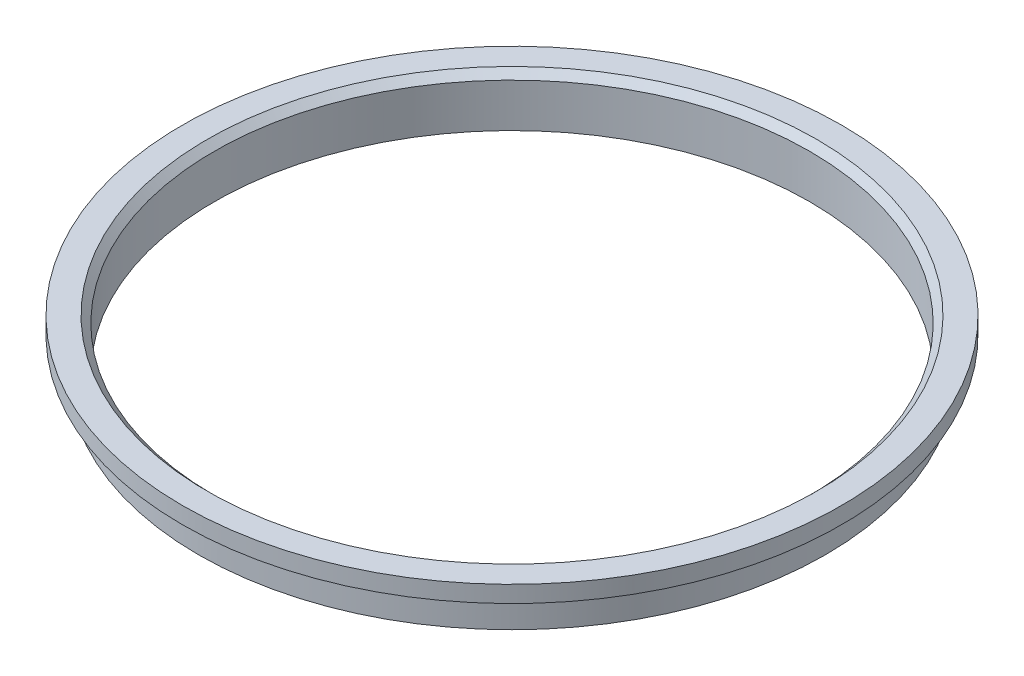
ISO-10303-21;
HEADER;
FILE_DESCRIPTION(('STEP AP214'),'2;1');
FILE_NAME('part.step','',(''),(''),'','','');
FILE_SCHEMA(('AUTOMOTIVE_DESIGN { 1 0 10303 214 1 1 1 1 }'));
ENDSEC;
DATA;
#1=APPLICATION_CONTEXT('core data for automotive mechanical design processes');
#2=APPLICATION_PROTOCOL_DEFINITION('international standard','automotive_design',2000,#1);
#3=PRODUCT_CONTEXT('',#1,'mechanical');
#4=PRODUCT('Part','Part','',(#3));
#5=PRODUCT_RELATED_PRODUCT_CATEGORY('part','',(#4));
#6=PRODUCT_DEFINITION_FORMATION('','',#4);
#7=PRODUCT_DEFINITION_CONTEXT('part definition',#1,'design');
#8=PRODUCT_DEFINITION('design','',#6,#7);
#9=PRODUCT_DEFINITION_SHAPE('','',#8);
#10=(LENGTH_UNIT() NAMED_UNIT(*) SI_UNIT(.MILLI.,.METRE.));
#11=(NAMED_UNIT(*) PLANE_ANGLE_UNIT() SI_UNIT($,.RADIAN.));
#12=(NAMED_UNIT(*) SI_UNIT($,.STERADIAN.) SOLID_ANGLE_UNIT());
#13=UNCERTAINTY_MEASURE_WITH_UNIT(LENGTH_MEASURE(1.E-05),#10,'distance_accuracy_value','');
#14=(GEOMETRIC_REPRESENTATION_CONTEXT(3) GLOBAL_UNCERTAINTY_ASSIGNED_CONTEXT((#13)) GLOBAL_UNIT_ASSIGNED_CONTEXT((#10,
#11,#12)) REPRESENTATION_CONTEXT('',''));
#15=CARTESIAN_POINT('',(0.,0.,0.));
#16=DIRECTION('',(0.,0.,1.));
#17=DIRECTION('',(1.,0.,0.));
#18=AXIS2_PLACEMENT_3D('',#15,#16,#17);
#19=CARTESIAN_POINT('',(-54.55285,-9.27100000000001,0.));
#20=DIRECTION('',(0.,1.,0.));
#21=DIRECTION('',(0.,0.,1.));
#22=AXIS2_PLACEMENT_3D('',#19,#20,#21);
#23=PLANE('',#22);
#24=CARTESIAN_POINT('',(0.,-9.27100000000001,0.));
#25=DIRECTION('',(0.,-1.,0.));
#26=DIRECTION('',(0.,0.,-1.));
#27=AXIS2_PLACEMENT_3D('',#24,#25,#26);
#28=CIRCLE('',#27,54.55285);
#29=CARTESIAN_POINT('',(0.,-9.27100000000001,-54.55285));
#30=VERTEX_POINT('',#29);
#31=EDGE_CURVE('E61',#30,#30,#28,.T.);
#32=ORIENTED_EDGE('',*,*,#31,.F.);
#33=EDGE_LOOP('',(#32));
#34=FACE_BOUND('',#33,.T.);
#35=CARTESIAN_POINT('',(0.,-9.27100000000001,0.));
#36=DIRECTION('',(0.,-1.,0.));
#37=DIRECTION('',(0.,0.,-1.));
#38=AXIS2_PLACEMENT_3D('',#35,#36,#37);
#39=CIRCLE('',#38,57.43575);
#40=CARTESIAN_POINT('',(0.,-9.27100000000001,-57.43575));
#41=VERTEX_POINT('',#40);
#42=EDGE_CURVE('E52',#41,#41,#39,.T.);
#43=ORIENTED_EDGE('',*,*,#42,.T.);
#44=EDGE_LOOP('',(#43));
#45=FACE_BOUND('',#44,.T.);
#46=ADVANCED_FACE('F32',(#34,#45),#23,.F.);
#47=CARTESIAN_POINT('',(0.,0.,0.));
#48=DIRECTION('',(0.,-1.,0.));
#49=DIRECTION('',(0.,0.,-1.));
#50=AXIS2_PLACEMENT_3D('',#47,#48,#49);
#51=CYLINDRICAL_SURFACE('',#50,57.43575);
#52=CARTESIAN_POINT('',(0.,-4.63550000000001,0.));
#53=DIRECTION('',(0.,1.,0.));
#54=DIRECTION('',(0.,0.,1.));
#55=AXIS2_PLACEMENT_3D('',#52,#53,#54);
#56=CIRCLE('',#55,57.43575);
#57=CARTESIAN_POINT('',(0.,-4.63550000000001,57.43575));
#58=VERTEX_POINT('',#57);
#59=EDGE_CURVE('E39',#58,#58,#56,.F.);
#60=ORIENTED_EDGE('',*,*,#59,.T.);
#61=EDGE_LOOP('',(#60));
#62=FACE_BOUND('',#61,.T.);
#63=ORIENTED_EDGE('',*,*,#42,.F.);
#64=EDGE_LOOP('',(#63));
#65=FACE_BOUND('',#64,.T.);
#66=ADVANCED_FACE('F69',(#62,#65),#51,.T.);
#67=CARTESIAN_POINT('',(-57.43575,-3.04800000000001,0.));
#68=DIRECTION('',(0.,1.,0.));
#69=DIRECTION('',(0.,0.,1.));
#70=AXIS2_PLACEMENT_3D('',#67,#68,#69);
#71=PLANE('',#70);
#72=CARTESIAN_POINT('',(0.,-3.04800000000001,0.));
#73=DIRECTION('',(0.,1.,0.));
#74=DIRECTION('',(0.,0.,1.));
#75=AXIS2_PLACEMENT_3D('',#72,#73,#74);
#76=CIRCLE('',#75,59.02325);
#77=CARTESIAN_POINT('',(0.,-3.04800000000001,59.02325));
#78=VERTEX_POINT('',#77);
#79=EDGE_CURVE('E10',#78,#78,#76,.T.);
#80=ORIENTED_EDGE('',*,*,#79,.T.);
#81=EDGE_LOOP('',(#80));
#82=FACE_BOUND('',#81,.T.);
#83=CARTESIAN_POINT('',(0.,-3.04800000000001,0.));
#84=DIRECTION('',(0.,-1.,0.));
#85=DIRECTION('',(0.,0.,-1.));
#86=AXIS2_PLACEMENT_3D('',#83,#84,#85);
#87=CIRCLE('',#86,60.3631);
#88=CARTESIAN_POINT('',(0.,-3.04800000000001,-60.3631));
#89=VERTEX_POINT('',#88);
#90=EDGE_CURVE('E55',#89,#89,#87,.T.);
#91=ORIENTED_EDGE('',*,*,#90,.T.);
#92=EDGE_LOOP('',(#91));
#93=FACE_BOUND('',#92,.T.);
#94=ADVANCED_FACE('F74',(#82,#93),#71,.F.);
#95=CARTESIAN_POINT('',(0.,0.,0.));
#96=DIRECTION('',(0.,-1.,0.));
#97=DIRECTION('',(0.,0.,-1.));
#98=AXIS2_PLACEMENT_3D('',#95,#96,#97);
#99=CYLINDRICAL_SURFACE('',#98,60.3631);
#100=ORIENTED_EDGE('',*,*,#90,.F.);
#101=EDGE_LOOP('',(#100));
#102=FACE_BOUND('',#101,.T.);
#103=CARTESIAN_POINT('',(0.,0.,0.));
#104=DIRECTION('',(0.,-1.,0.));
#105=DIRECTION('',(0.,0.,-1.));
#106=AXIS2_PLACEMENT_3D('',#103,#104,#105);
#107=CIRCLE('',#106,60.3631);
#108=CARTESIAN_POINT('',(0.,0.,-60.3631));
#109=VERTEX_POINT('',#108);
#110=EDGE_CURVE('E58',#109,#109,#107,.T.);
#111=ORIENTED_EDGE('',*,*,#110,.T.);
#112=EDGE_LOOP('',(#111));
#113=FACE_BOUND('',#112,.T.);
#114=ADVANCED_FACE('F79',(#102,#113),#99,.T.);
#115=CARTESIAN_POINT('',(-60.3631,0.,0.));
#116=DIRECTION('',(0.,-1.,0.));
#117=DIRECTION('',(0.,0.,-1.));
#118=AXIS2_PLACEMENT_3D('',#115,#116,#117);
#119=PLANE('',#118);
#120=CARTESIAN_POINT('',(0.,0.,0.));
#121=DIRECTION('',(0.,-1.,0.));
#122=DIRECTION('',(0.,0.,-1.));
#123=AXIS2_PLACEMENT_3D('',#120,#121,#122);
#124=CIRCLE('',#123,55.8228499999999);
#125=CARTESIAN_POINT('',(0.,0.,-55.8228499999999));
#126=VERTEX_POINT('',#125);
#127=EDGE_CURVE('E47',#126,#126,#124,.T.);
#128=ORIENTED_EDGE('',*,*,#127,.T.);
#129=EDGE_LOOP('',(#128));
#130=FACE_BOUND('',#129,.T.);
#131=ORIENTED_EDGE('',*,*,#110,.F.);
#132=EDGE_LOOP('',(#131));
#133=FACE_BOUND('',#132,.T.);
#134=ADVANCED_FACE('F90',(#130,#133),#119,.F.);
#135=CARTESIAN_POINT('',(0.,0.,0.));
#136=DIRECTION('',(0.,-1.,0.));
#137=DIRECTION('',(0.,0.,-1.));
#138=AXIS2_PLACEMENT_3D('',#135,#136,#137);
#139=CYLINDRICAL_SURFACE('',#138,54.55285);
#140=CARTESIAN_POINT('',(0.,-1.26999999999998,0.));
#141=DIRECTION('',(0.,-1.,0.));
#142=DIRECTION('',(0.,0.,-1.));
#143=AXIS2_PLACEMENT_3D('',#140,#141,#142);
#144=CIRCLE('',#143,54.55285);
#145=CARTESIAN_POINT('',(0.,-1.26999999999998,-54.55285));
#146=VERTEX_POINT('',#145);
#147=EDGE_CURVE('E43',#146,#146,#144,.F.);
#148=ORIENTED_EDGE('',*,*,#147,.T.);
#149=EDGE_LOOP('',(#148));
#150=FACE_BOUND('',#149,.T.);
#151=ORIENTED_EDGE('',*,*,#31,.T.);
#152=EDGE_LOOP('',(#151));
#153=FACE_BOUND('',#152,.T.);
#154=ADVANCED_FACE('F65',(#150,#153),#139,.F.);
#155=CARTESIAN_POINT('',(0.,0.,0.));
#156=DIRECTION('',(0.,1.,0.));
#157=DIRECTION('',(0.,0.,1.));
#158=AXIS2_PLACEMENT_3D('',#155,#156,#157);
#159=CONICAL_SURFACE('',#158,55.8228499999999,0.785398163397443);
#160=ORIENTED_EDGE('',*,*,#147,.F.);
#161=EDGE_LOOP('',(#160));
#162=FACE_BOUND('',#161,.T.);
#163=ORIENTED_EDGE('',*,*,#127,.F.);
#164=EDGE_LOOP('',(#163));
#165=FACE_BOUND('',#164,.T.);
#166=ADVANCED_FACE('F82',(#162,#165),#159,.F.);
#167=CARTESIAN_POINT('',(0.,-4.63550000000001,0.));
#168=DIRECTION('',(0.,1.,0.));
#169=DIRECTION('',(0.,0.,1.));
#170=AXIS2_PLACEMENT_3D('',#167,#168,#169);
#171=TOROIDAL_SURFACE('',#170,59.02325,1.5875);
#172=ORIENTED_EDGE('',*,*,#79,.F.);
#173=EDGE_LOOP('',(#172));
#174=FACE_BOUND('',#173,.T.);
#175=ORIENTED_EDGE('',*,*,#59,.F.);
#176=EDGE_LOOP('',(#175));
#177=FACE_BOUND('',#176,.T.);
#178=ADVANCED_FACE('F34',(#174,#177),#171,.F.);
#179=CLOSED_SHELL('',(#46,#66,#94,#114,#134,#154,#166,#178));
#180=MANIFOLD_SOLID_BREP('B2',#179);
#181=ADVANCED_BREP_SHAPE_REPRESENTATION('',(#18,#180),#14);
#182=SHAPE_DEFINITION_REPRESENTATION(#9,#181);
ENDSEC;
END-ISO-10303-21;
